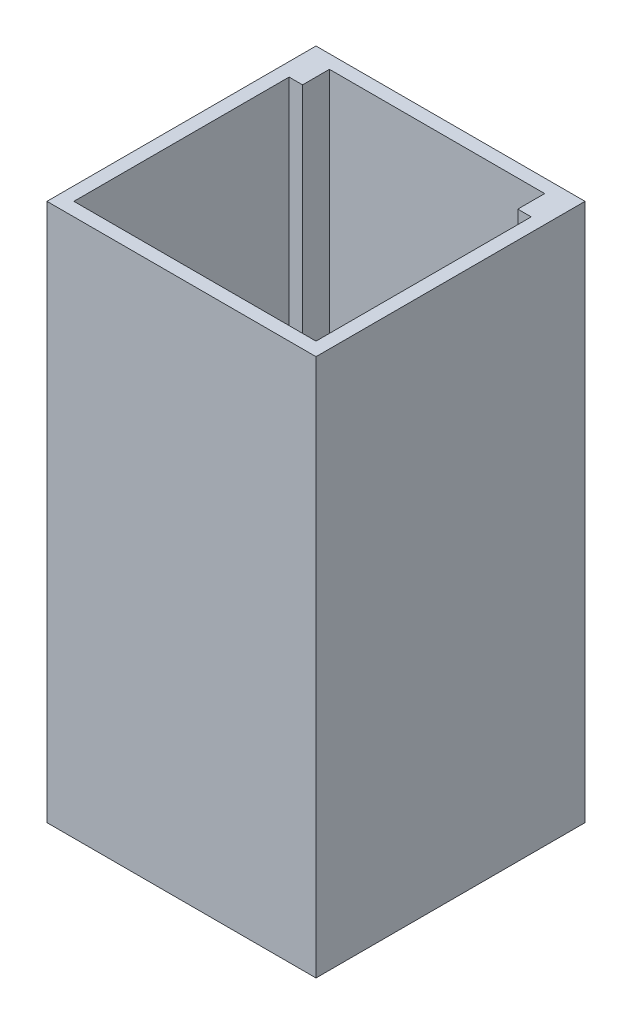
ISO-10303-21;
HEADER;
FILE_DESCRIPTION(('STEP AP214'),'2;1');
FILE_NAME('part.step','',(''),(''),'','','');
FILE_SCHEMA(('AUTOMOTIVE_DESIGN { 1 0 10303 214 1 1 1 1 }'));
ENDSEC;
DATA;
#1=APPLICATION_CONTEXT('core data for automotive mechanical design processes');
#2=APPLICATION_PROTOCOL_DEFINITION('international standard','automotive_design',2000,#1);
#3=PRODUCT_CONTEXT('',#1,'mechanical');
#4=PRODUCT('Part','Part','',(#3));
#5=PRODUCT_RELATED_PRODUCT_CATEGORY('part','',(#4));
#6=PRODUCT_DEFINITION_FORMATION('','',#4);
#7=PRODUCT_DEFINITION_CONTEXT('part definition',#1,'design');
#8=PRODUCT_DEFINITION('design','',#6,#7);
#9=PRODUCT_DEFINITION_SHAPE('','',#8);
#10=(LENGTH_UNIT() NAMED_UNIT(*) SI_UNIT(.MILLI.,.METRE.));
#11=(NAMED_UNIT(*) PLANE_ANGLE_UNIT() SI_UNIT($,.RADIAN.));
#12=(NAMED_UNIT(*) SI_UNIT($,.STERADIAN.) SOLID_ANGLE_UNIT());
#13=UNCERTAINTY_MEASURE_WITH_UNIT(LENGTH_MEASURE(1.E-05),#10,'distance_accuracy_value','');
#14=(GEOMETRIC_REPRESENTATION_CONTEXT(3) GLOBAL_UNCERTAINTY_ASSIGNED_CONTEXT((#13)) GLOBAL_UNIT_ASSIGNED_CONTEXT((#10,
#11,#12)) REPRESENTATION_CONTEXT('',''));
#15=CARTESIAN_POINT('',(0.,0.,0.));
#16=DIRECTION('',(0.,0.,1.));
#17=DIRECTION('',(1.,0.,0.));
#18=AXIS2_PLACEMENT_3D('',#15,#16,#17);
#19=CARTESIAN_POINT('',(-50.,100.,50.));
#20=DIRECTION('',(1.,0.,0.));
#21=DIRECTION('',(0.,0.,-1.));
#22=AXIS2_PLACEMENT_3D('',#19,#20,#21);
#23=PLANE('',#22);
#24=DIRECTION('',(0.,0.,1.));
#25=VECTOR('',#24,1.);
#26=CARTESIAN_POINT('',(-50.,-100.,50.));
#27=LINE('',#26,#25);
#28=CARTESIAN_POINT('',(-50.,-100.,-50.));
#29=VERTEX_POINT('',#28);
#30=CARTESIAN_POINT('',(-50.,-100.,50.));
#31=VERTEX_POINT('',#30);
#32=EDGE_CURVE('E181',#29,#31,#27,.T.);
#33=ORIENTED_EDGE('',*,*,#32,.T.);
#34=DIRECTION('',(0.,-1.,0.));
#35=VECTOR('',#34,1.);
#36=CARTESIAN_POINT('',(-50.,100.,50.));
#37=LINE('',#36,#35);
#38=CARTESIAN_POINT('',(-50.,100.,50.));
#39=VERTEX_POINT('',#38);
#40=EDGE_CURVE('E11',#39,#31,#37,.T.);
#41=ORIENTED_EDGE('',*,*,#40,.F.);
#42=DIRECTION('',(0.,0.,1.));
#43=VECTOR('',#42,1.);
#44=CARTESIAN_POINT('',(-50.,100.,50.));
#45=LINE('',#44,#43);
#46=CARTESIAN_POINT('',(-50.,100.,-50.));
#47=VERTEX_POINT('',#46);
#48=EDGE_CURVE('E196',#47,#39,#45,.T.);
#49=ORIENTED_EDGE('',*,*,#48,.F.);
#50=DIRECTION('',(0.,-1.,0.));
#51=VECTOR('',#50,1.);
#52=CARTESIAN_POINT('',(-50.,100.,-50.));
#53=LINE('',#52,#51);
#54=EDGE_CURVE('E206',#47,#29,#53,.T.);
#55=ORIENTED_EDGE('',*,*,#54,.T.);
#56=EDGE_LOOP('',(#33,#41,#49,#55));
#57=FACE_BOUND('',#56,.T.);
#58=ADVANCED_FACE('F39',(#57),#23,.F.);
#59=CARTESIAN_POINT('',(50.,100.,50.));
#60=DIRECTION('',(0.,0.,-1.));
#61=DIRECTION('',(-1.,0.,0.));
#62=AXIS2_PLACEMENT_3D('',#59,#60,#61);
#63=PLANE('',#62);
#64=DIRECTION('',(1.,0.,0.));
#65=VECTOR('',#64,1.);
#66=CARTESIAN_POINT('',(50.,-100.,50.));
#67=LINE('',#66,#65);
#68=CARTESIAN_POINT('',(50.,-100.,50.));
#69=VERTEX_POINT('',#68);
#70=EDGE_CURVE('E209',#31,#69,#67,.T.);
#71=ORIENTED_EDGE('',*,*,#70,.T.);
#72=DIRECTION('',(0.,-1.,0.));
#73=VECTOR('',#72,1.);
#74=CARTESIAN_POINT('',(50.,100.,50.));
#75=LINE('',#74,#73);
#76=CARTESIAN_POINT('',(50.,100.,50.));
#77=VERTEX_POINT('',#76);
#78=EDGE_CURVE('E46',#77,#69,#75,.T.);
#79=ORIENTED_EDGE('',*,*,#78,.F.);
#80=DIRECTION('',(1.,0.,0.));
#81=VECTOR('',#80,1.);
#82=CARTESIAN_POINT('',(50.,100.,50.));
#83=LINE('',#82,#81);
#84=EDGE_CURVE('E199',#39,#77,#83,.T.);
#85=ORIENTED_EDGE('',*,*,#84,.F.);
#86=ORIENTED_EDGE('',*,*,#40,.T.);
#87=EDGE_LOOP('',(#71,#79,#85,#86));
#88=FACE_BOUND('',#87,.T.);
#89=ADVANCED_FACE('F239',(#88),#63,.F.);
#90=CARTESIAN_POINT('',(50.,100.,50.));
#91=DIRECTION('',(-1.,0.,0.));
#92=DIRECTION('',(0.,0.,1.));
#93=AXIS2_PLACEMENT_3D('',#90,#91,#92);
#94=PLANE('',#93);
#95=DIRECTION('',(0.,0.,-1.));
#96=VECTOR('',#95,1.);
#97=CARTESIAN_POINT('',(50.,-100.,50.));
#98=LINE('',#97,#96);
#99=CARTESIAN_POINT('',(50.,-100.,-50.));
#100=VERTEX_POINT('',#99);
#101=EDGE_CURVE('E211',#69,#100,#98,.T.);
#102=ORIENTED_EDGE('',*,*,#101,.T.);
#103=DIRECTION('',(0.,-1.,0.));
#104=VECTOR('',#103,1.);
#105=CARTESIAN_POINT('',(50.,100.,-50.));
#106=LINE('',#105,#104);
#107=CARTESIAN_POINT('',(50.,100.,-50.));
#108=VERTEX_POINT('',#107);
#109=EDGE_CURVE('E216',#108,#100,#106,.T.);
#110=ORIENTED_EDGE('',*,*,#109,.F.);
#111=DIRECTION('',(0.,0.,-1.));
#112=VECTOR('',#111,1.);
#113=CARTESIAN_POINT('',(50.,100.,50.));
#114=LINE('',#113,#112);
#115=EDGE_CURVE('E202',#77,#108,#114,.T.);
#116=ORIENTED_EDGE('',*,*,#115,.F.);
#117=ORIENTED_EDGE('',*,*,#78,.T.);
#118=EDGE_LOOP('',(#102,#110,#116,#117));
#119=FACE_BOUND('',#118,.T.);
#120=ADVANCED_FACE('F223',(#119),#94,.F.);
#121=CARTESIAN_POINT('',(50.,100.,-50.));
#122=DIRECTION('',(0.,0.,1.));
#123=DIRECTION('',(1.,0.,0.));
#124=AXIS2_PLACEMENT_3D('',#121,#122,#123);
#125=PLANE('',#124);
#126=DIRECTION('',(-1.,0.,0.));
#127=VECTOR('',#126,1.);
#128=CARTESIAN_POINT('',(50.,-100.,-50.));
#129=LINE('',#128,#127);
#130=EDGE_CURVE('E200',#100,#29,#129,.T.);
#131=ORIENTED_EDGE('',*,*,#130,.T.);
#132=ORIENTED_EDGE('',*,*,#54,.F.);
#133=DIRECTION('',(-1.,0.,0.));
#134=VECTOR('',#133,1.);
#135=CARTESIAN_POINT('',(50.,100.,-50.));
#136=LINE('',#135,#134);
#137=EDGE_CURVE('E204',#108,#47,#136,.T.);
#138=ORIENTED_EDGE('',*,*,#137,.F.);
#139=ORIENTED_EDGE('',*,*,#109,.T.);
#140=EDGE_LOOP('',(#131,#132,#138,#139));
#141=FACE_BOUND('',#140,.T.);
#142=ADVANCED_FACE('F232',(#141),#125,.F.);
#143=CARTESIAN_POINT('',(0.,100.,0.));
#144=DIRECTION('',(0.,1.,0.));
#145=DIRECTION('',(0.,0.,1.));
#146=AXIS2_PLACEMENT_3D('',#143,#144,#145);
#147=PLANE('',#146);
#148=DIRECTION('',(0.,0.,1.));
#149=VECTOR('',#148,1.);
#150=CARTESIAN_POINT('',(-45.,100.,50.));
#151=LINE('',#150,#149);
#152=CARTESIAN_POINT('',(-45.,100.,-35.));
#153=VERTEX_POINT('',#152);
#154=CARTESIAN_POINT('',(-45.,100.,45.));
#155=VERTEX_POINT('',#154);
#156=EDGE_CURVE('E190',#153,#155,#151,.T.);
#157=ORIENTED_EDGE('',*,*,#156,.F.);
#158=DIRECTION('',(1.,0.,0.));
#159=VECTOR('',#158,1.);
#160=CARTESIAN_POINT('',(-45.,100.,-35.));
#161=LINE('',#160,#159);
#162=CARTESIAN_POINT('',(-40.,100.,-35.));
#163=VERTEX_POINT('',#162);
#164=EDGE_CURVE('E170',#153,#163,#161,.T.);
#165=ORIENTED_EDGE('',*,*,#164,.T.);
#166=DIRECTION('',(0.,0.,-1.));
#167=VECTOR('',#166,1.);
#168=CARTESIAN_POINT('',(-40.,100.,-45.));
#169=LINE('',#168,#167);
#170=CARTESIAN_POINT('',(-40.,100.,-45.));
#171=VERTEX_POINT('',#170);
#172=EDGE_CURVE('E167',#163,#171,#169,.T.);
#173=ORIENTED_EDGE('',*,*,#172,.T.);
#174=DIRECTION('',(-1.,0.,0.));
#175=VECTOR('',#174,1.);
#176=CARTESIAN_POINT('',(50.,100.,-45.));
#177=LINE('',#176,#175);
#178=CARTESIAN_POINT('',(40.,100.,-45.));
#179=VERTEX_POINT('',#178);
#180=EDGE_CURVE('E186',#179,#171,#177,.T.);
#181=ORIENTED_EDGE('',*,*,#180,.F.);
#182=DIRECTION('',(0.,0.,1.));
#183=VECTOR('',#182,1.);
#184=CARTESIAN_POINT('',(40.,100.,-45.));
#185=LINE('',#184,#183);
#186=CARTESIAN_POINT('',(40.,100.,-35.));
#187=VERTEX_POINT('',#186);
#188=EDGE_CURVE('E155',#179,#187,#185,.T.);
#189=ORIENTED_EDGE('',*,*,#188,.T.);
#190=DIRECTION('',(1.,0.,0.));
#191=VECTOR('',#190,1.);
#192=CARTESIAN_POINT('',(45.,100.,-35.));
#193=LINE('',#192,#191);
#194=CARTESIAN_POINT('',(45.,100.,-35.));
#195=VERTEX_POINT('',#194);
#196=EDGE_CURVE('E151',#187,#195,#193,.T.);
#197=ORIENTED_EDGE('',*,*,#196,.T.);
#198=DIRECTION('',(0.,0.,-1.));
#199=VECTOR('',#198,1.);
#200=CARTESIAN_POINT('',(45.,100.,50.));
#201=LINE('',#200,#199);
#202=CARTESIAN_POINT('',(45.,100.,45.));
#203=VERTEX_POINT('',#202);
#204=EDGE_CURVE('E61',#203,#195,#201,.T.);
#205=ORIENTED_EDGE('',*,*,#204,.F.);
#206=DIRECTION('',(1.,0.,0.));
#207=VECTOR('',#206,1.);
#208=CARTESIAN_POINT('',(50.,100.,45.));
#209=LINE('',#208,#207);
#210=EDGE_CURVE('E192',#155,#203,#209,.T.);
#211=ORIENTED_EDGE('',*,*,#210,.F.);
#212=EDGE_LOOP('',(#157,#165,#173,#181,#189,#197,#205,#211));
#213=FACE_BOUND('',#212,.T.);
#214=ORIENTED_EDGE('',*,*,#48,.T.);
#215=ORIENTED_EDGE('',*,*,#84,.T.);
#216=ORIENTED_EDGE('',*,*,#115,.T.);
#217=ORIENTED_EDGE('',*,*,#137,.T.);
#218=EDGE_LOOP('',(#214,#215,#216,#217));
#219=FACE_BOUND('',#218,.T.);
#220=ADVANCED_FACE('F238',(#213,#219),#147,.T.);
#221=CARTESIAN_POINT('',(0.,-100.,0.));
#222=DIRECTION('',(0.,1.,0.));
#223=DIRECTION('',(0.,0.,1.));
#224=AXIS2_PLACEMENT_3D('',#221,#222,#223);
#225=PLANE('',#224);
#226=ORIENTED_EDGE('',*,*,#32,.F.);
#227=ORIENTED_EDGE('',*,*,#130,.F.);
#228=ORIENTED_EDGE('',*,*,#101,.F.);
#229=ORIENTED_EDGE('',*,*,#70,.F.);
#230=EDGE_LOOP('',(#226,#227,#228,#229));
#231=FACE_BOUND('',#230,.T.);
#232=ADVANCED_FACE('F229',(#231),#225,.F.);
#233=CARTESIAN_POINT('',(-45.,100.,50.));
#234=DIRECTION('',(1.,0.,0.));
#235=DIRECTION('',(0.,0.,-1.));
#236=AXIS2_PLACEMENT_3D('',#233,#234,#235);
#237=PLANE('',#236);
#238=DIRECTION('',(0.,1.,0.));
#239=VECTOR('',#238,1.);
#240=CARTESIAN_POINT('',(-45.,-100.002,-35.));
#241=LINE('',#240,#239);
#242=CARTESIAN_POINT('',(-45.,-95.,-35.));
#243=VERTEX_POINT('',#242);
#244=EDGE_CURVE('E53',#243,#153,#241,.T.);
#245=ORIENTED_EDGE('',*,*,#244,.T.);
#246=ORIENTED_EDGE('',*,*,#156,.T.);
#247=DIRECTION('',(0.,-1.,0.));
#248=VECTOR('',#247,1.);
#249=CARTESIAN_POINT('',(-45.,100.,45.));
#250=LINE('',#249,#248);
#251=CARTESIAN_POINT('',(-45.,-95.,45.));
#252=VERTEX_POINT('',#251);
#253=EDGE_CURVE('E178',#155,#252,#250,.T.);
#254=ORIENTED_EDGE('',*,*,#253,.T.);
#255=DIRECTION('',(0.,0.,1.));
#256=VECTOR('',#255,1.);
#257=CARTESIAN_POINT('',(-45.,-95.,50.));
#258=LINE('',#257,#256);
#259=EDGE_CURVE('E175',#243,#252,#258,.T.);
#260=ORIENTED_EDGE('',*,*,#259,.F.);
#261=EDGE_LOOP('',(#245,#246,#254,#260));
#262=FACE_BOUND('',#261,.T.);
#263=ADVANCED_FACE('F251',(#262),#237,.T.);
#264=CARTESIAN_POINT('',(50.,100.,45.));
#265=DIRECTION('',(0.,0.,-1.));
#266=DIRECTION('',(-1.,0.,0.));
#267=AXIS2_PLACEMENT_3D('',#264,#265,#266);
#268=PLANE('',#267);
#269=DIRECTION('',(1.,0.,0.));
#270=VECTOR('',#269,1.);
#271=CARTESIAN_POINT('',(50.,-95.,45.));
#272=LINE('',#271,#270);
#273=CARTESIAN_POINT('',(45.,-95.,45.));
#274=VERTEX_POINT('',#273);
#275=EDGE_CURVE('E177',#252,#274,#272,.T.);
#276=ORIENTED_EDGE('',*,*,#275,.F.);
#277=ORIENTED_EDGE('',*,*,#253,.F.);
#278=ORIENTED_EDGE('',*,*,#210,.T.);
#279=DIRECTION('',(0.,-1.,0.));
#280=VECTOR('',#279,1.);
#281=CARTESIAN_POINT('',(45.,100.,45.));
#282=LINE('',#281,#280);
#283=EDGE_CURVE('E182',#203,#274,#282,.T.);
#284=ORIENTED_EDGE('',*,*,#283,.T.);
#285=EDGE_LOOP('',(#276,#277,#278,#284));
#286=FACE_BOUND('',#285,.T.);
#287=ADVANCED_FACE('F266',(#286),#268,.T.);
#288=CARTESIAN_POINT('',(45.,100.,50.));
#289=DIRECTION('',(-1.,0.,0.));
#290=DIRECTION('',(0.,0.,1.));
#291=AXIS2_PLACEMENT_3D('',#288,#289,#290);
#292=PLANE('',#291);
#293=DIRECTION('',(0.,1.,0.));
#294=VECTOR('',#293,1.);
#295=CARTESIAN_POINT('',(45.,-100.002,-35.));
#296=LINE('',#295,#294);
#297=CARTESIAN_POINT('',(45.,-95.,-35.));
#298=VERTEX_POINT('',#297);
#299=EDGE_CURVE('E153',#298,#195,#296,.T.);
#300=ORIENTED_EDGE('',*,*,#299,.F.);
#301=DIRECTION('',(0.,0.,-1.));
#302=VECTOR('',#301,1.);
#303=CARTESIAN_POINT('',(45.,-95.,50.));
#304=LINE('',#303,#302);
#305=EDGE_CURVE('E136',#274,#298,#304,.T.);
#306=ORIENTED_EDGE('',*,*,#305,.F.);
#307=ORIENTED_EDGE('',*,*,#283,.F.);
#308=ORIENTED_EDGE('',*,*,#204,.T.);
#309=EDGE_LOOP('',(#300,#306,#307,#308));
#310=FACE_BOUND('',#309,.T.);
#311=ADVANCED_FACE('F262',(#310),#292,.T.);
#312=CARTESIAN_POINT('',(50.,100.,-45.));
#313=DIRECTION('',(0.,0.,1.));
#314=DIRECTION('',(1.,0.,0.));
#315=AXIS2_PLACEMENT_3D('',#312,#313,#314);
#316=PLANE('',#315);
#317=DIRECTION('',(0.,1.,0.));
#318=VECTOR('',#317,1.);
#319=CARTESIAN_POINT('',(40.,-100.002,-45.));
#320=LINE('',#319,#318);
#321=CARTESIAN_POINT('',(40.,-95.,-45.));
#322=VERTEX_POINT('',#321);
#323=EDGE_CURVE('E147',#322,#179,#320,.T.);
#324=ORIENTED_EDGE('',*,*,#323,.T.);
#325=ORIENTED_EDGE('',*,*,#180,.T.);
#326=DIRECTION('',(0.,1.,0.));
#327=VECTOR('',#326,1.);
#328=CARTESIAN_POINT('',(-40.,-100.002,-45.));
#329=LINE('',#328,#327);
#330=CARTESIAN_POINT('',(-40.,-95.,-45.));
#331=VERTEX_POINT('',#330);
#332=EDGE_CURVE('E163',#331,#171,#329,.T.);
#333=ORIENTED_EDGE('',*,*,#332,.F.);
#334=DIRECTION('',(-1.,0.,0.));
#335=VECTOR('',#334,1.);
#336=CARTESIAN_POINT('',(50.,-95.,-45.));
#337=LINE('',#336,#335);
#338=EDGE_CURVE('E188',#322,#331,#337,.T.);
#339=ORIENTED_EDGE('',*,*,#338,.F.);
#340=EDGE_LOOP('',(#324,#325,#333,#339));
#341=FACE_BOUND('',#340,.T.);
#342=ADVANCED_FACE('F258',(#341),#316,.T.);
#343=CARTESIAN_POINT('',(0.,-95.,0.));
#344=DIRECTION('',(0.,1.,0.));
#345=DIRECTION('',(0.,0.,1.));
#346=AXIS2_PLACEMENT_3D('',#343,#344,#345);
#347=PLANE('',#346);
#348=DIRECTION('',(-1.,0.,0.));
#349=VECTOR('',#348,1.);
#350=CARTESIAN_POINT('',(45.,-95.,-35.));
#351=LINE('',#350,#349);
#352=CARTESIAN_POINT('',(40.,-95.,-35.));
#353=VERTEX_POINT('',#352);
#354=EDGE_CURVE('E129',#298,#353,#351,.T.);
#355=ORIENTED_EDGE('',*,*,#354,.T.);
#356=DIRECTION('',(0.,0.,-1.));
#357=VECTOR('',#356,1.);
#358=CARTESIAN_POINT('',(40.,-95.,-45.));
#359=LINE('',#358,#357);
#360=EDGE_CURVE('E133',#353,#322,#359,.T.);
#361=ORIENTED_EDGE('',*,*,#360,.T.);
#362=ORIENTED_EDGE('',*,*,#338,.T.);
#363=DIRECTION('',(0.,0.,1.));
#364=VECTOR('',#363,1.);
#365=CARTESIAN_POINT('',(-40.,-95.,-45.));
#366=LINE('',#365,#364);
#367=CARTESIAN_POINT('',(-40.,-95.,-35.));
#368=VERTEX_POINT('',#367);
#369=EDGE_CURVE('E139',#331,#368,#366,.T.);
#370=ORIENTED_EDGE('',*,*,#369,.T.);
#371=DIRECTION('',(-1.,0.,0.));
#372=VECTOR('',#371,1.);
#373=CARTESIAN_POINT('',(-45.,-95.,-35.));
#374=LINE('',#373,#372);
#375=EDGE_CURVE('E161',#368,#243,#374,.T.);
#376=ORIENTED_EDGE('',*,*,#375,.T.);
#377=ORIENTED_EDGE('',*,*,#259,.T.);
#378=ORIENTED_EDGE('',*,*,#275,.T.);
#379=ORIENTED_EDGE('',*,*,#305,.T.);
#380=EDGE_LOOP('',(#355,#361,#362,#370,#376,#377,#378,#379));
#381=FACE_BOUND('',#380,.T.);
#382=ADVANCED_FACE('F131',(#381),#347,.T.);
#383=CARTESIAN_POINT('',(-40.,-100.002,-45.));
#384=DIRECTION('',(1.,0.,0.));
#385=DIRECTION('',(0.,0.,-1.));
#386=AXIS2_PLACEMENT_3D('',#383,#384,#385);
#387=PLANE('',#386);
#388=ORIENTED_EDGE('',*,*,#369,.F.);
#389=ORIENTED_EDGE('',*,*,#332,.T.);
#390=ORIENTED_EDGE('',*,*,#172,.F.);
#391=DIRECTION('',(0.,1.,0.));
#392=VECTOR('',#391,1.);
#393=CARTESIAN_POINT('',(-40.,-100.002,-35.));
#394=LINE('',#393,#392);
#395=EDGE_CURVE('E166',#368,#163,#394,.T.);
#396=ORIENTED_EDGE('',*,*,#395,.F.);
#397=EDGE_LOOP('',(#388,#389,#390,#396));
#398=FACE_BOUND('',#397,.T.);
#399=ADVANCED_FACE('F257',(#398),#387,.T.);
#400=CARTESIAN_POINT('',(-45.,-100.002,-35.));
#401=DIRECTION('',(0.,0.,1.));
#402=DIRECTION('',(1.,0.,0.));
#403=AXIS2_PLACEMENT_3D('',#400,#401,#402);
#404=PLANE('',#403);
#405=ORIENTED_EDGE('',*,*,#375,.F.);
#406=ORIENTED_EDGE('',*,*,#395,.T.);
#407=ORIENTED_EDGE('',*,*,#164,.F.);
#408=ORIENTED_EDGE('',*,*,#244,.F.);
#409=EDGE_LOOP('',(#405,#406,#407,#408));
#410=FACE_BOUND('',#409,.T.);
#411=ADVANCED_FACE('F259',(#410),#404,.T.);
#412=CARTESIAN_POINT('',(45.,-100.002,-35.));
#413=DIRECTION('',(0.,0.,1.));
#414=DIRECTION('',(1.,0.,0.));
#415=AXIS2_PLACEMENT_3D('',#412,#413,#414);
#416=PLANE('',#415);
#417=ORIENTED_EDGE('',*,*,#354,.F.);
#418=ORIENTED_EDGE('',*,*,#299,.T.);
#419=ORIENTED_EDGE('',*,*,#196,.F.);
#420=DIRECTION('',(0.,1.,0.));
#421=VECTOR('',#420,1.);
#422=CARTESIAN_POINT('',(40.,-100.002,-35.));
#423=LINE('',#422,#421);
#424=EDGE_CURVE('E145',#353,#187,#423,.T.);
#425=ORIENTED_EDGE('',*,*,#424,.F.);
#426=EDGE_LOOP('',(#417,#418,#419,#425));
#427=FACE_BOUND('',#426,.T.);
#428=ADVANCED_FACE('F149',(#427),#416,.T.);
#429=CARTESIAN_POINT('',(40.,-100.002,-45.));
#430=DIRECTION('',(-1.,0.,0.));
#431=DIRECTION('',(0.,0.,1.));
#432=AXIS2_PLACEMENT_3D('',#429,#430,#431);
#433=PLANE('',#432);
#434=ORIENTED_EDGE('',*,*,#360,.F.);
#435=ORIENTED_EDGE('',*,*,#424,.T.);
#436=ORIENTED_EDGE('',*,*,#188,.F.);
#437=ORIENTED_EDGE('',*,*,#323,.F.);
#438=EDGE_LOOP('',(#434,#435,#436,#437));
#439=FACE_BOUND('',#438,.T.);
#440=ADVANCED_FACE('F143',(#439),#433,.T.);
#441=CLOSED_SHELL('',(#58,#89,#120,#142,#220,#232,#263,#287,#311,#342,#382,#399,#411,#428,#440));
#442=MANIFOLD_SOLID_BREP('B2',#441);
#443=ADVANCED_BREP_SHAPE_REPRESENTATION('',(#18,#442),#14);
#444=SHAPE_DEFINITION_REPRESENTATION(#9,#443);
ENDSEC;
END-ISO-10303-21;
